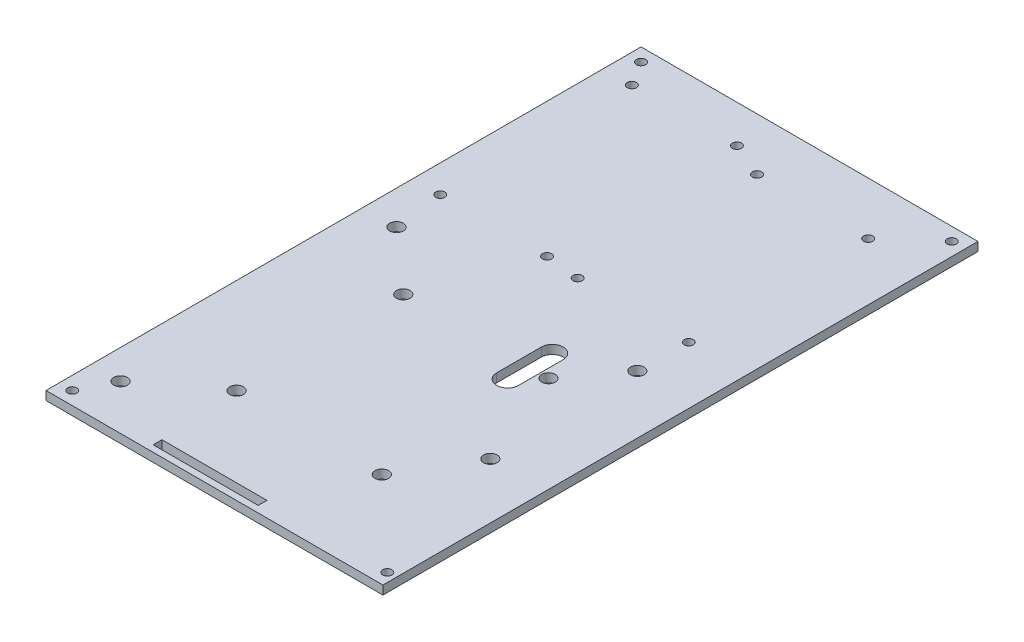
ISO-10303-21;
HEADER;
FILE_DESCRIPTION(('STEP AP214'),'2;1');
FILE_NAME('part.step','',(''),(''),'','','');
FILE_SCHEMA(('AUTOMOTIVE_DESIGN { 1 0 10303 214 1 1 1 1 }'));
ENDSEC;
DATA;
#1=APPLICATION_CONTEXT('core data for automotive mechanical design processes');
#2=APPLICATION_PROTOCOL_DEFINITION('international standard','automotive_design',2000,#1);
#3=PRODUCT_CONTEXT('',#1,'mechanical');
#4=PRODUCT('Part','Part','',(#3));
#5=PRODUCT_RELATED_PRODUCT_CATEGORY('part','',(#4));
#6=PRODUCT_DEFINITION_FORMATION('','',#4);
#7=PRODUCT_DEFINITION_CONTEXT('part definition',#1,'design');
#8=PRODUCT_DEFINITION('design','',#6,#7);
#9=PRODUCT_DEFINITION_SHAPE('','',#8);
#10=(LENGTH_UNIT() NAMED_UNIT(*) SI_UNIT(.MILLI.,.METRE.));
#11=(NAMED_UNIT(*) PLANE_ANGLE_UNIT() SI_UNIT($,.RADIAN.));
#12=(NAMED_UNIT(*) SI_UNIT($,.STERADIAN.) SOLID_ANGLE_UNIT());
#13=UNCERTAINTY_MEASURE_WITH_UNIT(LENGTH_MEASURE(1.E-05),#10,'distance_accuracy_value','');
#14=(GEOMETRIC_REPRESENTATION_CONTEXT(3) GLOBAL_UNCERTAINTY_ASSIGNED_CONTEXT((#13)) GLOBAL_UNIT_ASSIGNED_CONTEXT((#10,
#11,#12)) REPRESENTATION_CONTEXT('',''));
#15=CARTESIAN_POINT('',(0.,0.,0.));
#16=DIRECTION('',(0.,0.,1.));
#17=DIRECTION('',(1.,0.,0.));
#18=AXIS2_PLACEMENT_3D('',#15,#16,#17);
#19=CARTESIAN_POINT('',(0.,2.,0.));
#20=DIRECTION('',(0.,-1.,0.));
#21=DIRECTION('',(0.,0.,-1.));
#22=AXIS2_PLACEMENT_3D('',#19,#20,#21);
#23=PLANE('',#22);
#24=CARTESIAN_POINT('',(50.5,2.,-65.2));
#25=DIRECTION('',(0.,1.,0.));
#26=DIRECTION('',(0.,0.,1.));
#27=AXIS2_PLACEMENT_3D('',#24,#25,#26);
#28=CIRCLE('',#27,2.5);
#29=CARTESIAN_POINT('',(53.,2.,-65.2));
#30=VERTEX_POINT('',#29);
#31=CARTESIAN_POINT('',(48.,2.,-65.2));
#32=VERTEX_POINT('',#31);
#33=EDGE_CURVE('E177',#30,#32,#28,.T.);
#34=ORIENTED_EDGE('',*,*,#33,.F.);
#35=DIRECTION('',(0.,0.,-1.));
#36=VECTOR('',#35,1.);
#37=CARTESIAN_POINT('',(53.,2.,-65.2));
#38=LINE('',#37,#36);
#39=CARTESIAN_POINT('',(53.,2.,-55.));
#40=VERTEX_POINT('',#39);
#41=EDGE_CURVE('E188',#40,#30,#38,.T.);
#42=ORIENTED_EDGE('',*,*,#41,.F.);
#43=CARTESIAN_POINT('',(50.5,2.,-55.));
#44=DIRECTION('',(0.,1.,0.));
#45=DIRECTION('',(0.,0.,1.));
#46=AXIS2_PLACEMENT_3D('',#43,#44,#45);
#47=CIRCLE('',#46,2.5);
#48=CARTESIAN_POINT('',(48.,2.,-55.));
#49=VERTEX_POINT('',#48);
#50=EDGE_CURVE('E184',#49,#40,#47,.T.);
#51=ORIENTED_EDGE('',*,*,#50,.F.);
#52=DIRECTION('',(0.,0.,1.));
#53=VECTOR('',#52,1.);
#54=CARTESIAN_POINT('',(48.,2.,-65.2));
#55=LINE('',#54,#53);
#56=EDGE_CURVE('E180',#32,#49,#55,.T.);
#57=ORIENTED_EDGE('',*,*,#56,.F.);
#58=EDGE_LOOP('',(#34,#42,#51,#57));
#59=FACE_BOUND('',#58,.T.);
#60=DIRECTION('',(0.,0.,1.));
#61=VECTOR('',#60,1.);
#62=CARTESIAN_POINT('',(0.,2.,0.));
#63=LINE('',#62,#61);
#64=CARTESIAN_POINT('',(0.,2.,-136.));
#65=VERTEX_POINT('',#64);
#66=CARTESIAN_POINT('',(0.,2.,0.));
#67=VERTEX_POINT('',#66);
#68=EDGE_CURVE('E380',#65,#67,#63,.T.);
#69=ORIENTED_EDGE('',*,*,#68,.T.);
#70=DIRECTION('',(1.,0.,0.));
#71=VECTOR('',#70,1.);
#72=CARTESIAN_POINT('',(0.,2.,0.));
#73=LINE('',#72,#71);
#74=CARTESIAN_POINT('',(77.,2.,0.));
#75=VERTEX_POINT('',#74);
#76=EDGE_CURVE('E384',#67,#75,#73,.T.);
#77=ORIENTED_EDGE('',*,*,#76,.T.);
#78=DIRECTION('',(0.,0.,-1.));
#79=VECTOR('',#78,1.);
#80=CARTESIAN_POINT('',(77.,2.,0.));
#81=LINE('',#80,#79);
#82=CARTESIAN_POINT('',(77.,2.,-136.));
#83=VERTEX_POINT('',#82);
#84=EDGE_CURVE('E388',#75,#83,#81,.T.);
#85=ORIENTED_EDGE('',*,*,#84,.T.);
#86=DIRECTION('',(-1.,0.,0.));
#87=VECTOR('',#86,1.);
#88=CARTESIAN_POINT('',(0.,2.,-136.));
#89=LINE('',#88,#87);
#90=EDGE_CURVE('E391',#83,#65,#89,.T.);
#91=ORIENTED_EDGE('',*,*,#90,.T.);
#92=EDGE_LOOP('',(#69,#77,#85,#91));
#93=FACE_BOUND('',#92,.T.);
#94=CARTESIAN_POINT('',(7.71,2.,-72.38));
#95=DIRECTION('',(0.,1.,0.));
#96=DIRECTION('',(0.,0.,1.));
#97=AXIS2_PLACEMENT_3D('',#94,#95,#96);
#98=CIRCLE('',#97,1.54999999999999);
#99=CARTESIAN_POINT('',(7.71,2.,-70.83));
#100=VERTEX_POINT('',#99);
#101=EDGE_CURVE('E372',#100,#100,#98,.T.);
#102=ORIENTED_EDGE('',*,*,#101,.F.);
#103=EDGE_LOOP('',(#102));
#104=FACE_BOUND('',#103,.T.);
#105=CARTESIAN_POINT('',(6.71000000000001,2.,-10.34));
#106=DIRECTION('',(0.,1.,0.));
#107=DIRECTION('',(0.,0.,1.));
#108=AXIS2_PLACEMENT_3D('',#105,#106,#107);
#109=CIRCLE('',#108,1.55);
#110=CARTESIAN_POINT('',(6.71000000000001,2.,-8.79));
#111=VERTEX_POINT('',#110);
#112=EDGE_CURVE('E364',#111,#111,#109,.T.);
#113=ORIENTED_EDGE('',*,*,#112,.F.);
#114=EDGE_LOOP('',(#113));
#115=FACE_BOUND('',#114,.T.);
#116=CARTESIAN_POINT('',(63.71,2.,-71.44));
#117=DIRECTION('',(0.,1.,0.));
#118=DIRECTION('',(0.,0.,1.));
#119=AXIS2_PLACEMENT_3D('',#116,#117,#118);
#120=CIRCLE('',#119,1.54999999999999);
#121=CARTESIAN_POINT('',(63.71,2.,-69.89));
#122=VERTEX_POINT('',#121);
#123=EDGE_CURVE('E356',#122,#122,#120,.T.);
#124=ORIENTED_EDGE('',*,*,#123,.F.);
#125=EDGE_LOOP('',(#124));
#126=FACE_BOUND('',#125,.T.);
#127=CARTESIAN_POINT('',(64.31,2.,-37.24));
#128=DIRECTION('',(0.,1.,0.));
#129=DIRECTION('',(0.,0.,1.));
#130=AXIS2_PLACEMENT_3D('',#127,#128,#129);
#131=CIRCLE('',#130,1.54999999999999);
#132=CARTESIAN_POINT('',(64.31,2.,-35.69));
#133=VERTEX_POINT('',#132);
#134=EDGE_CURVE('E348',#133,#133,#131,.T.);
#135=ORIENTED_EDGE('',*,*,#134,.F.);
#136=EDGE_LOOP('',(#135));
#137=FACE_BOUND('',#136,.T.);
#138=CARTESIAN_POINT('',(21.81,2.,-21.74));
#139=DIRECTION('',(0.,1.,0.));
#140=DIRECTION('',(0.,0.,1.));
#141=AXIS2_PLACEMENT_3D('',#138,#139,#140);
#142=CIRCLE('',#141,1.55);
#143=CARTESIAN_POINT('',(21.81,2.,-20.19));
#144=VERTEX_POINT('',#143);
#145=EDGE_CURVE('E340',#144,#144,#142,.T.);
#146=ORIENTED_EDGE('',*,*,#145,.F.);
#147=EDGE_LOOP('',(#146));
#148=FACE_BOUND('',#147,.T.);
#149=CARTESIAN_POINT('',(55.01,2.,-21.74));
#150=DIRECTION('',(0.,1.,0.));
#151=DIRECTION('',(0.,0.,1.));
#152=AXIS2_PLACEMENT_3D('',#149,#150,#151);
#153=CIRCLE('',#152,1.55);
#154=CARTESIAN_POINT('',(55.01,2.,-20.19));
#155=VERTEX_POINT('',#154);
#156=EDGE_CURVE('E332',#155,#155,#153,.T.);
#157=ORIENTED_EDGE('',*,*,#156,.F.);
#158=EDGE_LOOP('',(#157));
#159=FACE_BOUND('',#158,.T.);
#160=CARTESIAN_POINT('',(21.81,2.,-59.84));
#161=DIRECTION('',(0.,1.,0.));
#162=DIRECTION('',(0.,0.,1.));
#163=AXIS2_PLACEMENT_3D('',#160,#161,#162);
#164=CIRCLE('',#163,1.55);
#165=CARTESIAN_POINT('',(21.81,2.,-58.29));
#166=VERTEX_POINT('',#165);
#167=EDGE_CURVE('E324',#166,#166,#164,.T.);
#168=ORIENTED_EDGE('',*,*,#167,.F.);
#169=EDGE_LOOP('',(#168));
#170=FACE_BOUND('',#169,.T.);
#171=CARTESIAN_POINT('',(55.01,2.,-59.84));
#172=DIRECTION('',(0.,1.,0.));
#173=DIRECTION('',(0.,0.,1.));
#174=AXIS2_PLACEMENT_3D('',#171,#172,#173);
#175=CIRCLE('',#174,1.55);
#176=CARTESIAN_POINT('',(55.01,2.,-58.29));
#177=VERTEX_POINT('',#176);
#178=EDGE_CURVE('E316',#177,#177,#175,.T.);
#179=ORIENTED_EDGE('',*,*,#178,.F.);
#180=EDGE_LOOP('',(#179));
#181=FACE_BOUND('',#180,.T.);
#182=CARTESIAN_POINT('',(6.49999999999999,2.,-127.4));
#183=DIRECTION('',(0.,1.,0.));
#184=DIRECTION('',(0.,0.,1.));
#185=AXIS2_PLACEMENT_3D('',#182,#183,#184);
#186=CIRCLE('',#185,1.04999999999999);
#187=CARTESIAN_POINT('',(6.49999999999999,2.,-126.35));
#188=VERTEX_POINT('',#187);
#189=EDGE_CURVE('E308',#188,#188,#186,.T.);
#190=ORIENTED_EDGE('',*,*,#189,.F.);
#191=EDGE_LOOP('',(#190));
#192=FACE_BOUND('',#191,.T.);
#193=CARTESIAN_POINT('',(30.5,2.,-127.4));
#194=DIRECTION('',(0.,1.,0.));
#195=DIRECTION('',(0.,0.,1.));
#196=AXIS2_PLACEMENT_3D('',#193,#194,#195);
#197=CIRCLE('',#196,1.05);
#198=CARTESIAN_POINT('',(30.5,2.,-126.35));
#199=VERTEX_POINT('',#198);
#200=EDGE_CURVE('E300',#199,#199,#197,.T.);
#201=ORIENTED_EDGE('',*,*,#200,.F.);
#202=EDGE_LOOP('',(#201));
#203=FACE_BOUND('',#202,.T.);
#204=CARTESIAN_POINT('',(6.3,2.,-83.8));
#205=DIRECTION('',(0.,1.,0.));
#206=DIRECTION('',(0.,0.,1.));
#207=AXIS2_PLACEMENT_3D('',#204,#205,#206);
#208=CIRCLE('',#207,1.04999999999999);
#209=CARTESIAN_POINT('',(6.3,2.,-82.75));
#210=VERTEX_POINT('',#209);
#211=EDGE_CURVE('E292',#210,#210,#208,.T.);
#212=ORIENTED_EDGE('',*,*,#211,.F.);
#213=EDGE_LOOP('',(#212));
#214=FACE_BOUND('',#213,.T.);
#215=CARTESIAN_POINT('',(30.7,2.,-83.8));
#216=DIRECTION('',(0.,1.,0.));
#217=DIRECTION('',(0.,0.,1.));
#218=AXIS2_PLACEMENT_3D('',#215,#216,#217);
#219=CIRCLE('',#218,1.05);
#220=CARTESIAN_POINT('',(30.7,2.,-82.75));
#221=VERTEX_POINT('',#220);
#222=EDGE_CURVE('E284',#221,#221,#219,.T.);
#223=ORIENTED_EDGE('',*,*,#222,.F.);
#224=EDGE_LOOP('',(#223));
#225=FACE_BOUND('',#224,.T.);
#226=CARTESIAN_POINT('',(38.5,2.,-124.));
#227=DIRECTION('',(0.,1.,0.));
#228=DIRECTION('',(0.,0.,1.));
#229=AXIS2_PLACEMENT_3D('',#226,#227,#228);
#230=CIRCLE('',#229,1.05);
#231=CARTESIAN_POINT('',(38.5,2.,-122.95));
#232=VERTEX_POINT('',#231);
#233=EDGE_CURVE('E276',#232,#232,#230,.T.);
#234=ORIENTED_EDGE('',*,*,#233,.F.);
#235=EDGE_LOOP('',(#234));
#236=FACE_BOUND('',#235,.T.);
#237=CARTESIAN_POINT('',(63.9,2.,-124.));
#238=DIRECTION('',(0.,1.,0.));
#239=DIRECTION('',(0.,0.,1.));
#240=AXIS2_PLACEMENT_3D('',#237,#238,#239);
#241=CIRCLE('',#240,1.04999999999999);
#242=CARTESIAN_POINT('',(63.9,2.,-122.95));
#243=VERTEX_POINT('',#242);
#244=EDGE_CURVE('E268',#243,#243,#241,.T.);
#245=ORIENTED_EDGE('',*,*,#244,.F.);
#246=EDGE_LOOP('',(#245));
#247=FACE_BOUND('',#246,.T.);
#248=CARTESIAN_POINT('',(38.5,2.,-83.));
#249=DIRECTION('',(0.,1.,0.));
#250=DIRECTION('',(0.,0.,1.));
#251=AXIS2_PLACEMENT_3D('',#248,#249,#250);
#252=CIRCLE('',#251,1.05);
#253=CARTESIAN_POINT('',(38.5,2.,-81.95));
#254=VERTEX_POINT('',#253);
#255=EDGE_CURVE('E260',#254,#254,#252,.T.);
#256=ORIENTED_EDGE('',*,*,#255,.F.);
#257=EDGE_LOOP('',(#256));
#258=FACE_BOUND('',#257,.T.);
#259=CARTESIAN_POINT('',(63.9,2.,-83.));
#260=DIRECTION('',(0.,1.,0.));
#261=DIRECTION('',(0.,0.,1.));
#262=AXIS2_PLACEMENT_3D('',#259,#260,#261);
#263=CIRCLE('',#262,1.04999999999999);
#264=CARTESIAN_POINT('',(63.9,2.,-81.95));
#265=VERTEX_POINT('',#264);
#266=EDGE_CURVE('E252',#265,#265,#263,.T.);
#267=ORIENTED_EDGE('',*,*,#266,.F.);
#268=EDGE_LOOP('',(#267));
#269=FACE_BOUND('',#268,.T.);
#270=CARTESIAN_POINT('',(3.00000000000002,2.,-3.));
#271=DIRECTION('',(0.,1.,0.));
#272=DIRECTION('',(0.,0.,1.));
#273=AXIS2_PLACEMENT_3D('',#270,#271,#272);
#274=CIRCLE('',#273,1.05);
#275=CARTESIAN_POINT('',(3.00000000000002,2.,-1.95));
#276=VERTEX_POINT('',#275);
#277=EDGE_CURVE('E244',#276,#276,#274,.T.);
#278=ORIENTED_EDGE('',*,*,#277,.F.);
#279=EDGE_LOOP('',(#278));
#280=FACE_BOUND('',#279,.T.);
#281=CARTESIAN_POINT('',(75.,2.,-3.));
#282=DIRECTION('',(0.,1.,0.));
#283=DIRECTION('',(0.,0.,1.));
#284=AXIS2_PLACEMENT_3D('',#281,#282,#283);
#285=CIRCLE('',#284,1.04999999999999);
#286=CARTESIAN_POINT('',(75.,2.,-1.95000000000001));
#287=VERTEX_POINT('',#286);
#288=EDGE_CURVE('E236',#287,#287,#285,.T.);
#289=ORIENTED_EDGE('',*,*,#288,.F.);
#290=EDGE_LOOP('',(#289));
#291=FACE_BOUND('',#290,.T.);
#292=CARTESIAN_POINT('',(3.,2.,-133.));
#293=DIRECTION('',(0.,1.,0.));
#294=DIRECTION('',(0.,0.,1.));
#295=AXIS2_PLACEMENT_3D('',#292,#293,#294);
#296=CIRCLE('',#295,1.04999999999999);
#297=CARTESIAN_POINT('',(3.,2.,-131.95));
#298=VERTEX_POINT('',#297);
#299=EDGE_CURVE('E228',#298,#298,#296,.T.);
#300=ORIENTED_EDGE('',*,*,#299,.F.);
#301=EDGE_LOOP('',(#300));
#302=FACE_BOUND('',#301,.T.);
#303=CARTESIAN_POINT('',(74.,2.,-133.));
#304=DIRECTION('',(0.,1.,0.));
#305=DIRECTION('',(0.,0.,1.));
#306=AXIS2_PLACEMENT_3D('',#303,#304,#305);
#307=CIRCLE('',#306,1.04999999999999);
#308=CARTESIAN_POINT('',(74.,2.,-131.95));
#309=VERTEX_POINT('',#308);
#310=EDGE_CURVE('E220',#309,#309,#307,.T.);
#311=ORIENTED_EDGE('',*,*,#310,.F.);
#312=EDGE_LOOP('',(#311));
#313=FACE_BOUND('',#312,.T.);
#314=DIRECTION('',(0.,0.,1.));
#315=VECTOR('',#314,1.);
#316=CARTESIAN_POINT('',(23.,2.,-1.5));
#317=LINE('',#316,#315);
#318=CARTESIAN_POINT('',(23.,2.,-3.5));
#319=VERTEX_POINT('',#318);
#320=CARTESIAN_POINT('',(23.,2.,-1.5));
#321=VERTEX_POINT('',#320);
#322=EDGE_CURVE('E129',#319,#321,#317,.T.);
#323=ORIENTED_EDGE('',*,*,#322,.F.);
#324=DIRECTION('',(-1.,0.,0.));
#325=VECTOR('',#324,1.);
#326=CARTESIAN_POINT('',(23.,2.,-3.5));
#327=LINE('',#326,#325);
#328=CARTESIAN_POINT('',(47.,2.,-3.5));
#329=VERTEX_POINT('',#328);
#330=EDGE_CURVE('E155',#329,#319,#327,.T.);
#331=ORIENTED_EDGE('',*,*,#330,.F.);
#332=DIRECTION('',(0.,0.,-1.));
#333=VECTOR('',#332,1.);
#334=CARTESIAN_POINT('',(47.,2.,-1.5));
#335=LINE('',#334,#333);
#336=CARTESIAN_POINT('',(47.,2.,-1.5));
#337=VERTEX_POINT('',#336);
#338=EDGE_CURVE('E151',#337,#329,#335,.T.);
#339=ORIENTED_EDGE('',*,*,#338,.F.);
#340=DIRECTION('',(1.,0.,0.));
#341=VECTOR('',#340,1.);
#342=CARTESIAN_POINT('',(23.,2.,-1.5));
#343=LINE('',#342,#341);
#344=EDGE_CURVE('E138',#321,#337,#343,.T.);
#345=ORIENTED_EDGE('',*,*,#344,.F.);
#346=EDGE_LOOP('',(#323,#331,#339,#345));
#347=FACE_BOUND('',#346,.T.);
#348=ADVANCED_FACE('F39',(#59,#93,#104,#115,#126,#137,#148,#159,#170,#181,#192,#203,#214,#225,
#236,#247,#258,#269,#280,#291,#302,#313,#347),#23,.F.);
#349=CARTESIAN_POINT('',(0.,0.,0.));
#350=DIRECTION('',(0.,-1.,0.));
#351=DIRECTION('',(0.,0.,-1.));
#352=AXIS2_PLACEMENT_3D('',#349,#350,#351);
#353=PLANE('',#352);
#354=CARTESIAN_POINT('',(3.,0.,-133.));
#355=DIRECTION('',(0.,1.,0.));
#356=DIRECTION('',(0.,0.,1.));
#357=AXIS2_PLACEMENT_3D('',#354,#355,#356);
#358=CIRCLE('',#357,1.04999999999999);
#359=CARTESIAN_POINT('',(3.,0.,-131.95));
#360=VERTEX_POINT('',#359);
#361=EDGE_CURVE('E224',#360,#360,#358,.T.);
#362=ORIENTED_EDGE('',*,*,#361,.T.);
#363=EDGE_LOOP('',(#362));
#364=FACE_BOUND('',#363,.T.);
#365=CARTESIAN_POINT('',(3.00000000000002,0.,-3.));
#366=DIRECTION('',(0.,1.,0.));
#367=DIRECTION('',(0.,0.,1.));
#368=AXIS2_PLACEMENT_3D('',#365,#366,#367);
#369=CIRCLE('',#368,1.05);
#370=CARTESIAN_POINT('',(3.00000000000002,0.,-1.95));
#371=VERTEX_POINT('',#370);
#372=EDGE_CURVE('E240',#371,#371,#369,.T.);
#373=ORIENTED_EDGE('',*,*,#372,.T.);
#374=EDGE_LOOP('',(#373));
#375=FACE_BOUND('',#374,.T.);
#376=CARTESIAN_POINT('',(38.5,0.,-83.));
#377=DIRECTION('',(0.,1.,0.));
#378=DIRECTION('',(0.,0.,1.));
#379=AXIS2_PLACEMENT_3D('',#376,#377,#378);
#380=CIRCLE('',#379,1.05);
#381=CARTESIAN_POINT('',(38.5,0.,-81.95));
#382=VERTEX_POINT('',#381);
#383=EDGE_CURVE('E256',#382,#382,#380,.T.);
#384=ORIENTED_EDGE('',*,*,#383,.T.);
#385=EDGE_LOOP('',(#384));
#386=FACE_BOUND('',#385,.T.);
#387=CARTESIAN_POINT('',(38.5,0.,-124.));
#388=DIRECTION('',(0.,1.,0.));
#389=DIRECTION('',(0.,0.,1.));
#390=AXIS2_PLACEMENT_3D('',#387,#388,#389);
#391=CIRCLE('',#390,1.05);
#392=CARTESIAN_POINT('',(38.5,0.,-122.95));
#393=VERTEX_POINT('',#392);
#394=EDGE_CURVE('E272',#393,#393,#391,.T.);
#395=ORIENTED_EDGE('',*,*,#394,.T.);
#396=EDGE_LOOP('',(#395));
#397=FACE_BOUND('',#396,.T.);
#398=CARTESIAN_POINT('',(6.3,0.,-83.8));
#399=DIRECTION('',(0.,1.,0.));
#400=DIRECTION('',(0.,0.,1.));
#401=AXIS2_PLACEMENT_3D('',#398,#399,#400);
#402=CIRCLE('',#401,1.04999999999999);
#403=CARTESIAN_POINT('',(6.3,0.,-82.75));
#404=VERTEX_POINT('',#403);
#405=EDGE_CURVE('E288',#404,#404,#402,.T.);
#406=ORIENTED_EDGE('',*,*,#405,.T.);
#407=EDGE_LOOP('',(#406));
#408=FACE_BOUND('',#407,.T.);
#409=CARTESIAN_POINT('',(6.49999999999999,0.,-127.4));
#410=DIRECTION('',(0.,1.,0.));
#411=DIRECTION('',(0.,0.,1.));
#412=AXIS2_PLACEMENT_3D('',#409,#410,#411);
#413=CIRCLE('',#412,1.04999999999999);
#414=CARTESIAN_POINT('',(6.49999999999999,0.,-126.35));
#415=VERTEX_POINT('',#414);
#416=EDGE_CURVE('E304',#415,#415,#413,.T.);
#417=ORIENTED_EDGE('',*,*,#416,.T.);
#418=EDGE_LOOP('',(#417));
#419=FACE_BOUND('',#418,.T.);
#420=CARTESIAN_POINT('',(21.81,0.,-59.84));
#421=DIRECTION('',(0.,1.,0.));
#422=DIRECTION('',(0.,0.,1.));
#423=AXIS2_PLACEMENT_3D('',#420,#421,#422);
#424=CIRCLE('',#423,1.55);
#425=CARTESIAN_POINT('',(21.81,0.,-58.29));
#426=VERTEX_POINT('',#425);
#427=EDGE_CURVE('E320',#426,#426,#424,.T.);
#428=ORIENTED_EDGE('',*,*,#427,.T.);
#429=EDGE_LOOP('',(#428));
#430=FACE_BOUND('',#429,.T.);
#431=CARTESIAN_POINT('',(21.81,0.,-21.74));
#432=DIRECTION('',(0.,1.,0.));
#433=DIRECTION('',(0.,0.,1.));
#434=AXIS2_PLACEMENT_3D('',#431,#432,#433);
#435=CIRCLE('',#434,1.55);
#436=CARTESIAN_POINT('',(21.81,0.,-20.19));
#437=VERTEX_POINT('',#436);
#438=EDGE_CURVE('E336',#437,#437,#435,.T.);
#439=ORIENTED_EDGE('',*,*,#438,.T.);
#440=EDGE_LOOP('',(#439));
#441=FACE_BOUND('',#440,.T.);
#442=CARTESIAN_POINT('',(63.71,0.,-71.44));
#443=DIRECTION('',(0.,1.,0.));
#444=DIRECTION('',(0.,0.,1.));
#445=AXIS2_PLACEMENT_3D('',#442,#443,#444);
#446=CIRCLE('',#445,1.54999999999999);
#447=CARTESIAN_POINT('',(63.71,0.,-69.89));
#448=VERTEX_POINT('',#447);
#449=EDGE_CURVE('E352',#448,#448,#446,.T.);
#450=ORIENTED_EDGE('',*,*,#449,.T.);
#451=EDGE_LOOP('',(#450));
#452=FACE_BOUND('',#451,.T.);
#453=CARTESIAN_POINT('',(7.71,0.,-72.38));
#454=DIRECTION('',(0.,1.,0.));
#455=DIRECTION('',(0.,0.,1.));
#456=AXIS2_PLACEMENT_3D('',#453,#454,#455);
#457=CIRCLE('',#456,1.54999999999999);
#458=CARTESIAN_POINT('',(7.71,0.,-70.83));
#459=VERTEX_POINT('',#458);
#460=EDGE_CURVE('E368',#459,#459,#457,.T.);
#461=ORIENTED_EDGE('',*,*,#460,.T.);
#462=EDGE_LOOP('',(#461));
#463=FACE_BOUND('',#462,.T.);
#464=DIRECTION('',(0.,0.,1.));
#465=VECTOR('',#464,1.);
#466=CARTESIAN_POINT('',(0.,0.,0.));
#467=LINE('',#466,#465);
#468=CARTESIAN_POINT('',(0.,0.,-136.));
#469=VERTEX_POINT('',#468);
#470=CARTESIAN_POINT('',(0.,0.,0.));
#471=VERTEX_POINT('',#470);
#472=EDGE_CURVE('E376',#469,#471,#467,.T.);
#473=ORIENTED_EDGE('',*,*,#472,.F.);
#474=DIRECTION('',(-1.,0.,0.));
#475=VECTOR('',#474,1.);
#476=CARTESIAN_POINT('',(0.,0.,-136.));
#477=LINE('',#476,#475);
#478=CARTESIAN_POINT('',(77.,0.,-136.));
#479=VERTEX_POINT('',#478);
#480=EDGE_CURVE('E385',#479,#469,#477,.T.);
#481=ORIENTED_EDGE('',*,*,#480,.F.);
#482=DIRECTION('',(0.,0.,-1.));
#483=VECTOR('',#482,1.);
#484=CARTESIAN_POINT('',(77.,0.,0.));
#485=LINE('',#484,#483);
#486=CARTESIAN_POINT('',(77.,0.,0.));
#487=VERTEX_POINT('',#486);
#488=EDGE_CURVE('E401',#487,#479,#485,.T.);
#489=ORIENTED_EDGE('',*,*,#488,.F.);
#490=DIRECTION('',(1.,0.,0.));
#491=VECTOR('',#490,1.);
#492=CARTESIAN_POINT('',(0.,0.,0.));
#493=LINE('',#492,#491);
#494=EDGE_CURVE('E398',#471,#487,#493,.T.);
#495=ORIENTED_EDGE('',*,*,#494,.F.);
#496=EDGE_LOOP('',(#473,#481,#489,#495));
#497=FACE_BOUND('',#496,.T.);
#498=CARTESIAN_POINT('',(6.71000000000001,0.,-10.34));
#499=DIRECTION('',(0.,1.,0.));
#500=DIRECTION('',(0.,0.,1.));
#501=AXIS2_PLACEMENT_3D('',#498,#499,#500);
#502=CIRCLE('',#501,1.55);
#503=CARTESIAN_POINT('',(6.71000000000001,0.,-8.79));
#504=VERTEX_POINT('',#503);
#505=EDGE_CURVE('E360',#504,#504,#502,.T.);
#506=ORIENTED_EDGE('',*,*,#505,.T.);
#507=EDGE_LOOP('',(#506));
#508=FACE_BOUND('',#507,.T.);
#509=CARTESIAN_POINT('',(64.31,0.,-37.24));
#510=DIRECTION('',(0.,1.,0.));
#511=DIRECTION('',(0.,0.,1.));
#512=AXIS2_PLACEMENT_3D('',#509,#510,#511);
#513=CIRCLE('',#512,1.54999999999999);
#514=CARTESIAN_POINT('',(64.31,0.,-35.69));
#515=VERTEX_POINT('',#514);
#516=EDGE_CURVE('E344',#515,#515,#513,.T.);
#517=ORIENTED_EDGE('',*,*,#516,.T.);
#518=EDGE_LOOP('',(#517));
#519=FACE_BOUND('',#518,.T.);
#520=CARTESIAN_POINT('',(55.01,0.,-21.74));
#521=DIRECTION('',(0.,1.,0.));
#522=DIRECTION('',(0.,0.,1.));
#523=AXIS2_PLACEMENT_3D('',#520,#521,#522);
#524=CIRCLE('',#523,1.55);
#525=CARTESIAN_POINT('',(55.01,0.,-20.19));
#526=VERTEX_POINT('',#525);
#527=EDGE_CURVE('E328',#526,#526,#524,.T.);
#528=ORIENTED_EDGE('',*,*,#527,.T.);
#529=EDGE_LOOP('',(#528));
#530=FACE_BOUND('',#529,.T.);
#531=CARTESIAN_POINT('',(55.01,0.,-59.84));
#532=DIRECTION('',(0.,1.,0.));
#533=DIRECTION('',(0.,0.,1.));
#534=AXIS2_PLACEMENT_3D('',#531,#532,#533);
#535=CIRCLE('',#534,1.55);
#536=CARTESIAN_POINT('',(55.01,0.,-58.29));
#537=VERTEX_POINT('',#536);
#538=EDGE_CURVE('E312',#537,#537,#535,.T.);
#539=ORIENTED_EDGE('',*,*,#538,.T.);
#540=EDGE_LOOP('',(#539));
#541=FACE_BOUND('',#540,.T.);
#542=CARTESIAN_POINT('',(30.5,0.,-127.4));
#543=DIRECTION('',(0.,1.,0.));
#544=DIRECTION('',(0.,0.,1.));
#545=AXIS2_PLACEMENT_3D('',#542,#543,#544);
#546=CIRCLE('',#545,1.05);
#547=CARTESIAN_POINT('',(30.5,0.,-126.35));
#548=VERTEX_POINT('',#547);
#549=EDGE_CURVE('E296',#548,#548,#546,.T.);
#550=ORIENTED_EDGE('',*,*,#549,.T.);
#551=EDGE_LOOP('',(#550));
#552=FACE_BOUND('',#551,.T.);
#553=CARTESIAN_POINT('',(30.7,0.,-83.8));
#554=DIRECTION('',(0.,1.,0.));
#555=DIRECTION('',(0.,0.,1.));
#556=AXIS2_PLACEMENT_3D('',#553,#554,#555);
#557=CIRCLE('',#556,1.05);
#558=CARTESIAN_POINT('',(30.7,0.,-82.75));
#559=VERTEX_POINT('',#558);
#560=EDGE_CURVE('E280',#559,#559,#557,.T.);
#561=ORIENTED_EDGE('',*,*,#560,.T.);
#562=EDGE_LOOP('',(#561));
#563=FACE_BOUND('',#562,.T.);
#564=CARTESIAN_POINT('',(63.9,0.,-124.));
#565=DIRECTION('',(0.,1.,0.));
#566=DIRECTION('',(0.,0.,1.));
#567=AXIS2_PLACEMENT_3D('',#564,#565,#566);
#568=CIRCLE('',#567,1.04999999999999);
#569=CARTESIAN_POINT('',(63.9,0.,-122.95));
#570=VERTEX_POINT('',#569);
#571=EDGE_CURVE('E264',#570,#570,#568,.T.);
#572=ORIENTED_EDGE('',*,*,#571,.T.);
#573=EDGE_LOOP('',(#572));
#574=FACE_BOUND('',#573,.T.);
#575=CARTESIAN_POINT('',(63.9,0.,-83.));
#576=DIRECTION('',(0.,1.,0.));
#577=DIRECTION('',(0.,0.,1.));
#578=AXIS2_PLACEMENT_3D('',#575,#576,#577);
#579=CIRCLE('',#578,1.04999999999999);
#580=CARTESIAN_POINT('',(63.9,0.,-81.95));
#581=VERTEX_POINT('',#580);
#582=EDGE_CURVE('E248',#581,#581,#579,.T.);
#583=ORIENTED_EDGE('',*,*,#582,.T.);
#584=EDGE_LOOP('',(#583));
#585=FACE_BOUND('',#584,.T.);
#586=CARTESIAN_POINT('',(75.,0.,-3.));
#587=DIRECTION('',(0.,1.,0.));
#588=DIRECTION('',(0.,0.,1.));
#589=AXIS2_PLACEMENT_3D('',#586,#587,#588);
#590=CIRCLE('',#589,1.04999999999999);
#591=CARTESIAN_POINT('',(75.,0.,-1.95000000000001));
#592=VERTEX_POINT('',#591);
#593=EDGE_CURVE('E232',#592,#592,#590,.T.);
#594=ORIENTED_EDGE('',*,*,#593,.T.);
#595=EDGE_LOOP('',(#594));
#596=FACE_BOUND('',#595,.T.);
#597=CARTESIAN_POINT('',(74.,0.,-133.));
#598=DIRECTION('',(0.,1.,0.));
#599=DIRECTION('',(0.,0.,1.));
#600=AXIS2_PLACEMENT_3D('',#597,#598,#599);
#601=CIRCLE('',#600,1.04999999999999);
#602=CARTESIAN_POINT('',(74.,0.,-131.95));
#603=VERTEX_POINT('',#602);
#604=EDGE_CURVE('E219',#603,#603,#601,.T.);
#605=ORIENTED_EDGE('',*,*,#604,.T.);
#606=EDGE_LOOP('',(#605));
#607=FACE_BOUND('',#606,.T.);
#608=DIRECTION('',(0.,0.,-1.));
#609=VECTOR('',#608,1.);
#610=CARTESIAN_POINT('',(53.,0.,-65.2));
#611=LINE('',#610,#609);
#612=CARTESIAN_POINT('',(53.,0.,-55.));
#613=VERTEX_POINT('',#612);
#614=CARTESIAN_POINT('',(53.,0.,-65.2));
#615=VERTEX_POINT('',#614);
#616=EDGE_CURVE('E181',#613,#615,#611,.T.);
#617=ORIENTED_EDGE('',*,*,#616,.T.);
#618=CARTESIAN_POINT('',(50.5,0.,-65.2));
#619=DIRECTION('',(0.,1.,0.));
#620=DIRECTION('',(0.,0.,1.));
#621=AXIS2_PLACEMENT_3D('',#618,#619,#620);
#622=CIRCLE('',#621,2.5);
#623=CARTESIAN_POINT('',(48.,0.,-65.2));
#624=VERTEX_POINT('',#623);
#625=EDGE_CURVE('E147',#615,#624,#622,.T.);
#626=ORIENTED_EDGE('',*,*,#625,.T.);
#627=DIRECTION('',(0.,0.,1.));
#628=VECTOR('',#627,1.);
#629=CARTESIAN_POINT('',(48.,0.,-65.2));
#630=LINE('',#629,#628);
#631=CARTESIAN_POINT('',(48.,0.,-55.));
#632=VERTEX_POINT('',#631);
#633=EDGE_CURVE('E195',#624,#632,#630,.T.);
#634=ORIENTED_EDGE('',*,*,#633,.T.);
#635=CARTESIAN_POINT('',(50.5,0.,-55.));
#636=DIRECTION('',(0.,1.,0.));
#637=DIRECTION('',(0.,0.,1.));
#638=AXIS2_PLACEMENT_3D('',#635,#636,#637);
#639=CIRCLE('',#638,2.5);
#640=EDGE_CURVE('E199',#632,#613,#639,.T.);
#641=ORIENTED_EDGE('',*,*,#640,.T.);
#642=EDGE_LOOP('',(#617,#626,#634,#641));
#643=FACE_BOUND('',#642,.T.);
#644=DIRECTION('',(-1.,0.,0.));
#645=VECTOR('',#644,1.);
#646=CARTESIAN_POINT('',(23.,0.,-3.5));
#647=LINE('',#646,#645);
#648=CARTESIAN_POINT('',(47.,0.,-3.5));
#649=VERTEX_POINT('',#648);
#650=CARTESIAN_POINT('',(23.,0.,-3.5));
#651=VERTEX_POINT('',#650);
#652=EDGE_CURVE('E139',#649,#651,#647,.T.);
#653=ORIENTED_EDGE('',*,*,#652,.T.);
#654=DIRECTION('',(0.,0.,1.));
#655=VECTOR('',#654,1.);
#656=CARTESIAN_POINT('',(23.,0.,-1.5));
#657=LINE('',#656,#655);
#658=CARTESIAN_POINT('',(23.,0.,-1.5));
#659=VERTEX_POINT('',#658);
#660=EDGE_CURVE('E63',#651,#659,#657,.T.);
#661=ORIENTED_EDGE('',*,*,#660,.T.);
#662=DIRECTION('',(1.,0.,0.));
#663=VECTOR('',#662,1.);
#664=CARTESIAN_POINT('',(23.,0.,-1.5));
#665=LINE('',#664,#663);
#666=CARTESIAN_POINT('',(47.,0.,-1.5));
#667=VERTEX_POINT('',#666);
#668=EDGE_CURVE('E145',#659,#667,#665,.T.);
#669=ORIENTED_EDGE('',*,*,#668,.T.);
#670=DIRECTION('',(0.,0.,-1.));
#671=VECTOR('',#670,1.);
#672=CARTESIAN_POINT('',(47.,0.,-1.5));
#673=LINE('',#672,#671);
#674=EDGE_CURVE('E164',#667,#649,#673,.T.);
#675=ORIENTED_EDGE('',*,*,#674,.T.);
#676=EDGE_LOOP('',(#653,#661,#669,#675));
#677=FACE_BOUND('',#676,.T.);
#678=ADVANCED_FACE('F424',(#364,#375,#386,#397,#408,#419,#430,#441,#452,#463,#497,#508,#519,
#530,#541,#552,#563,#574,#585,#596,#607,#643,#677),#353,.T.);
#679=CARTESIAN_POINT('',(0.,2.,0.));
#680=DIRECTION('',(1.,0.,0.));
#681=DIRECTION('',(0.,0.,-1.));
#682=AXIS2_PLACEMENT_3D('',#679,#680,#681);
#683=PLANE('',#682);
#684=ORIENTED_EDGE('',*,*,#472,.T.);
#685=DIRECTION('',(0.,-1.,0.));
#686=VECTOR('',#685,1.);
#687=CARTESIAN_POINT('',(0.,2.,0.));
#688=LINE('',#687,#686);
#689=EDGE_CURVE('E11',#67,#471,#688,.T.);
#690=ORIENTED_EDGE('',*,*,#689,.F.);
#691=ORIENTED_EDGE('',*,*,#68,.F.);
#692=DIRECTION('',(0.,-1.,0.));
#693=VECTOR('',#692,1.);
#694=CARTESIAN_POINT('',(0.,2.,-136.));
#695=LINE('',#694,#693);
#696=EDGE_CURVE('E394',#65,#469,#695,.T.);
#697=ORIENTED_EDGE('',*,*,#696,.T.);
#698=EDGE_LOOP('',(#684,#690,#691,#697));
#699=FACE_BOUND('',#698,.T.);
#700=ADVANCED_FACE('F41',(#699),#683,.F.);
#701=CARTESIAN_POINT('',(0.,2.,0.));
#702=DIRECTION('',(0.,0.,-1.));
#703=DIRECTION('',(-1.,0.,0.));
#704=AXIS2_PLACEMENT_3D('',#701,#702,#703);
#705=PLANE('',#704);
#706=ORIENTED_EDGE('',*,*,#494,.T.);
#707=DIRECTION('',(0.,-1.,0.));
#708=VECTOR('',#707,1.);
#709=CARTESIAN_POINT('',(77.,2.,0.));
#710=LINE('',#709,#708);
#711=EDGE_CURVE('E48',#75,#487,#710,.T.);
#712=ORIENTED_EDGE('',*,*,#711,.F.);
#713=ORIENTED_EDGE('',*,*,#76,.F.);
#714=ORIENTED_EDGE('',*,*,#689,.T.);
#715=EDGE_LOOP('',(#706,#712,#713,#714));
#716=FACE_BOUND('',#715,.T.);
#717=ADVANCED_FACE('F435',(#716),#705,.F.);
#718=CARTESIAN_POINT('',(77.,2.,0.));
#719=DIRECTION('',(-1.,0.,0.));
#720=DIRECTION('',(0.,0.,1.));
#721=AXIS2_PLACEMENT_3D('',#718,#719,#720);
#722=PLANE('',#721);
#723=ORIENTED_EDGE('',*,*,#488,.T.);
#724=DIRECTION('',(0.,-1.,0.));
#725=VECTOR('',#724,1.);
#726=CARTESIAN_POINT('',(77.,2.,-136.));
#727=LINE('',#726,#725);
#728=EDGE_CURVE('E409',#83,#479,#727,.T.);
#729=ORIENTED_EDGE('',*,*,#728,.F.);
#730=ORIENTED_EDGE('',*,*,#84,.F.);
#731=ORIENTED_EDGE('',*,*,#711,.T.);
#732=EDGE_LOOP('',(#723,#729,#730,#731));
#733=FACE_BOUND('',#732,.T.);
#734=ADVANCED_FACE('F418',(#733),#722,.F.);
#735=CARTESIAN_POINT('',(0.,2.,-136.));
#736=DIRECTION('',(0.,0.,1.));
#737=DIRECTION('',(1.,0.,0.));
#738=AXIS2_PLACEMENT_3D('',#735,#736,#737);
#739=PLANE('',#738);
#740=ORIENTED_EDGE('',*,*,#480,.T.);
#741=ORIENTED_EDGE('',*,*,#696,.F.);
#742=ORIENTED_EDGE('',*,*,#90,.F.);
#743=ORIENTED_EDGE('',*,*,#728,.T.);
#744=EDGE_LOOP('',(#740,#741,#742,#743));
#745=FACE_BOUND('',#744,.T.);
#746=ADVANCED_FACE('F428',(#745),#739,.F.);
#747=CARTESIAN_POINT('',(7.71,2.,-72.38));
#748=DIRECTION('',(0.,-1.,0.));
#749=DIRECTION('',(0.,0.,-1.));
#750=AXIS2_PLACEMENT_3D('',#747,#748,#749);
#751=CYLINDRICAL_SURFACE('',#750,1.54999999999999);
#752=ORIENTED_EDGE('',*,*,#101,.T.);
#753=EDGE_LOOP('',(#752));
#754=FACE_BOUND('',#753,.T.);
#755=ORIENTED_EDGE('',*,*,#460,.F.);
#756=EDGE_LOOP('',(#755));
#757=FACE_BOUND('',#756,.T.);
#758=ADVANCED_FACE('F452',(#754,#757),#751,.F.);
#759=CARTESIAN_POINT('',(6.71000000000001,2.,-10.34));
#760=DIRECTION('',(0.,-1.,0.));
#761=DIRECTION('',(0.,0.,-1.));
#762=AXIS2_PLACEMENT_3D('',#759,#760,#761);
#763=CYLINDRICAL_SURFACE('',#762,1.55);
#764=ORIENTED_EDGE('',*,*,#112,.T.);
#765=EDGE_LOOP('',(#764));
#766=FACE_BOUND('',#765,.T.);
#767=ORIENTED_EDGE('',*,*,#505,.F.);
#768=EDGE_LOOP('',(#767));
#769=FACE_BOUND('',#768,.T.);
#770=ADVANCED_FACE('F459',(#766,#769),#763,.F.);
#771=CARTESIAN_POINT('',(63.71,2.,-71.44));
#772=DIRECTION('',(0.,-1.,0.));
#773=DIRECTION('',(0.,0.,-1.));
#774=AXIS2_PLACEMENT_3D('',#771,#772,#773);
#775=CYLINDRICAL_SURFACE('',#774,1.54999999999999);
#776=ORIENTED_EDGE('',*,*,#123,.T.);
#777=EDGE_LOOP('',(#776));
#778=FACE_BOUND('',#777,.T.);
#779=ORIENTED_EDGE('',*,*,#449,.F.);
#780=EDGE_LOOP('',(#779));
#781=FACE_BOUND('',#780,.T.);
#782=ADVANCED_FACE('F464',(#778,#781),#775,.F.);
#783=CARTESIAN_POINT('',(64.31,2.,-37.24));
#784=DIRECTION('',(0.,-1.,0.));
#785=DIRECTION('',(0.,0.,-1.));
#786=AXIS2_PLACEMENT_3D('',#783,#784,#785);
#787=CYLINDRICAL_SURFACE('',#786,1.54999999999999);
#788=ORIENTED_EDGE('',*,*,#134,.T.);
#789=EDGE_LOOP('',(#788));
#790=FACE_BOUND('',#789,.T.);
#791=ORIENTED_EDGE('',*,*,#516,.F.);
#792=EDGE_LOOP('',(#791));
#793=FACE_BOUND('',#792,.T.);
#794=ADVANCED_FACE('F608',(#790,#793),#787,.F.);
#795=CARTESIAN_POINT('',(21.81,2.,-21.74));
#796=DIRECTION('',(0.,-1.,0.));
#797=DIRECTION('',(0.,0.,-1.));
#798=AXIS2_PLACEMENT_3D('',#795,#796,#797);
#799=CYLINDRICAL_SURFACE('',#798,1.55);
#800=ORIENTED_EDGE('',*,*,#145,.T.);
#801=EDGE_LOOP('',(#800));
#802=FACE_BOUND('',#801,.T.);
#803=ORIENTED_EDGE('',*,*,#438,.F.);
#804=EDGE_LOOP('',(#803));
#805=FACE_BOUND('',#804,.T.);
#806=ADVANCED_FACE('F604',(#802,#805),#799,.F.);
#807=CARTESIAN_POINT('',(55.01,2.,-21.74));
#808=DIRECTION('',(0.,-1.,0.));
#809=DIRECTION('',(0.,0.,-1.));
#810=AXIS2_PLACEMENT_3D('',#807,#808,#809);
#811=CYLINDRICAL_SURFACE('',#810,1.55);
#812=ORIENTED_EDGE('',*,*,#156,.T.);
#813=EDGE_LOOP('',(#812));
#814=FACE_BOUND('',#813,.T.);
#815=ORIENTED_EDGE('',*,*,#527,.F.);
#816=EDGE_LOOP('',(#815));
#817=FACE_BOUND('',#816,.T.);
#818=ADVANCED_FACE('F600',(#814,#817),#811,.F.);
#819=CARTESIAN_POINT('',(21.81,2.,-59.84));
#820=DIRECTION('',(0.,-1.,0.));
#821=DIRECTION('',(0.,0.,-1.));
#822=AXIS2_PLACEMENT_3D('',#819,#820,#821);
#823=CYLINDRICAL_SURFACE('',#822,1.55);
#824=ORIENTED_EDGE('',*,*,#167,.T.);
#825=EDGE_LOOP('',(#824));
#826=FACE_BOUND('',#825,.T.);
#827=ORIENTED_EDGE('',*,*,#427,.F.);
#828=EDGE_LOOP('',(#827));
#829=FACE_BOUND('',#828,.T.);
#830=ADVANCED_FACE('F596',(#826,#829),#823,.F.);
#831=CARTESIAN_POINT('',(55.01,2.,-59.84));
#832=DIRECTION('',(0.,-1.,0.));
#833=DIRECTION('',(0.,0.,-1.));
#834=AXIS2_PLACEMENT_3D('',#831,#832,#833);
#835=CYLINDRICAL_SURFACE('',#834,1.55);
#836=ORIENTED_EDGE('',*,*,#178,.T.);
#837=EDGE_LOOP('',(#836));
#838=FACE_BOUND('',#837,.T.);
#839=ORIENTED_EDGE('',*,*,#538,.F.);
#840=EDGE_LOOP('',(#839));
#841=FACE_BOUND('',#840,.T.);
#842=ADVANCED_FACE('F592',(#838,#841),#835,.F.);
#843=CARTESIAN_POINT('',(6.49999999999999,2.,-127.4));
#844=DIRECTION('',(0.,-1.,0.));
#845=DIRECTION('',(0.,0.,-1.));
#846=AXIS2_PLACEMENT_3D('',#843,#844,#845);
#847=CYLINDRICAL_SURFACE('',#846,1.04999999999999);
#848=ORIENTED_EDGE('',*,*,#189,.T.);
#849=EDGE_LOOP('',(#848));
#850=FACE_BOUND('',#849,.T.);
#851=ORIENTED_EDGE('',*,*,#416,.F.);
#852=EDGE_LOOP('',(#851));
#853=FACE_BOUND('',#852,.T.);
#854=ADVANCED_FACE('F588',(#850,#853),#847,.F.);
#855=CARTESIAN_POINT('',(30.5,2.,-127.4));
#856=DIRECTION('',(0.,-1.,0.));
#857=DIRECTION('',(0.,0.,-1.));
#858=AXIS2_PLACEMENT_3D('',#855,#856,#857);
#859=CYLINDRICAL_SURFACE('',#858,1.05);
#860=ORIENTED_EDGE('',*,*,#200,.T.);
#861=EDGE_LOOP('',(#860));
#862=FACE_BOUND('',#861,.T.);
#863=ORIENTED_EDGE('',*,*,#549,.F.);
#864=EDGE_LOOP('',(#863));
#865=FACE_BOUND('',#864,.T.);
#866=ADVANCED_FACE('F584',(#862,#865),#859,.F.);
#867=CARTESIAN_POINT('',(6.3,2.,-83.8));
#868=DIRECTION('',(0.,-1.,0.));
#869=DIRECTION('',(0.,0.,-1.));
#870=AXIS2_PLACEMENT_3D('',#867,#868,#869);
#871=CYLINDRICAL_SURFACE('',#870,1.04999999999999);
#872=ORIENTED_EDGE('',*,*,#211,.T.);
#873=EDGE_LOOP('',(#872));
#874=FACE_BOUND('',#873,.T.);
#875=ORIENTED_EDGE('',*,*,#405,.F.);
#876=EDGE_LOOP('',(#875));
#877=FACE_BOUND('',#876,.T.);
#878=ADVANCED_FACE('F580',(#874,#877),#871,.F.);
#879=CARTESIAN_POINT('',(30.7,2.,-83.8));
#880=DIRECTION('',(0.,-1.,0.));
#881=DIRECTION('',(0.,0.,-1.));
#882=AXIS2_PLACEMENT_3D('',#879,#880,#881);
#883=CYLINDRICAL_SURFACE('',#882,1.05);
#884=ORIENTED_EDGE('',*,*,#222,.T.);
#885=EDGE_LOOP('',(#884));
#886=FACE_BOUND('',#885,.T.);
#887=ORIENTED_EDGE('',*,*,#560,.F.);
#888=EDGE_LOOP('',(#887));
#889=FACE_BOUND('',#888,.T.);
#890=ADVANCED_FACE('F576',(#886,#889),#883,.F.);
#891=CARTESIAN_POINT('',(38.5,2.,-124.));
#892=DIRECTION('',(0.,-1.,0.));
#893=DIRECTION('',(0.,0.,-1.));
#894=AXIS2_PLACEMENT_3D('',#891,#892,#893);
#895=CYLINDRICAL_SURFACE('',#894,1.05);
#896=ORIENTED_EDGE('',*,*,#233,.T.);
#897=EDGE_LOOP('',(#896));
#898=FACE_BOUND('',#897,.T.);
#899=ORIENTED_EDGE('',*,*,#394,.F.);
#900=EDGE_LOOP('',(#899));
#901=FACE_BOUND('',#900,.T.);
#902=ADVANCED_FACE('F572',(#898,#901),#895,.F.);
#903=CARTESIAN_POINT('',(63.9,2.,-124.));
#904=DIRECTION('',(0.,-1.,0.));
#905=DIRECTION('',(0.,0.,-1.));
#906=AXIS2_PLACEMENT_3D('',#903,#904,#905);
#907=CYLINDRICAL_SURFACE('',#906,1.04999999999999);
#908=ORIENTED_EDGE('',*,*,#244,.T.);
#909=EDGE_LOOP('',(#908));
#910=FACE_BOUND('',#909,.T.);
#911=ORIENTED_EDGE('',*,*,#571,.F.);
#912=EDGE_LOOP('',(#911));
#913=FACE_BOUND('',#912,.T.);
#914=ADVANCED_FACE('F568',(#910,#913),#907,.F.);
#915=CARTESIAN_POINT('',(38.5,2.,-83.));
#916=DIRECTION('',(0.,-1.,0.));
#917=DIRECTION('',(0.,0.,-1.));
#918=AXIS2_PLACEMENT_3D('',#915,#916,#917);
#919=CYLINDRICAL_SURFACE('',#918,1.05);
#920=ORIENTED_EDGE('',*,*,#255,.T.);
#921=EDGE_LOOP('',(#920));
#922=FACE_BOUND('',#921,.T.);
#923=ORIENTED_EDGE('',*,*,#383,.F.);
#924=EDGE_LOOP('',(#923));
#925=FACE_BOUND('',#924,.T.);
#926=ADVANCED_FACE('F564',(#922,#925),#919,.F.);
#927=CARTESIAN_POINT('',(63.9,2.,-83.));
#928=DIRECTION('',(0.,-1.,0.));
#929=DIRECTION('',(0.,0.,-1.));
#930=AXIS2_PLACEMENT_3D('',#927,#928,#929);
#931=CYLINDRICAL_SURFACE('',#930,1.04999999999999);
#932=ORIENTED_EDGE('',*,*,#266,.T.);
#933=EDGE_LOOP('',(#932));
#934=FACE_BOUND('',#933,.T.);
#935=ORIENTED_EDGE('',*,*,#582,.F.);
#936=EDGE_LOOP('',(#935));
#937=FACE_BOUND('',#936,.T.);
#938=ADVANCED_FACE('F560',(#934,#937),#931,.F.);
#939=CARTESIAN_POINT('',(3.00000000000002,2.,-3.));
#940=DIRECTION('',(0.,-1.,0.));
#941=DIRECTION('',(0.,0.,-1.));
#942=AXIS2_PLACEMENT_3D('',#939,#940,#941);
#943=CYLINDRICAL_SURFACE('',#942,1.05);
#944=ORIENTED_EDGE('',*,*,#277,.T.);
#945=EDGE_LOOP('',(#944));
#946=FACE_BOUND('',#945,.T.);
#947=ORIENTED_EDGE('',*,*,#372,.F.);
#948=EDGE_LOOP('',(#947));
#949=FACE_BOUND('',#948,.T.);
#950=ADVANCED_FACE('F556',(#946,#949),#943,.F.);
#951=CARTESIAN_POINT('',(75.,2.,-3.));
#952=DIRECTION('',(0.,-1.,0.));
#953=DIRECTION('',(0.,0.,-1.));
#954=AXIS2_PLACEMENT_3D('',#951,#952,#953);
#955=CYLINDRICAL_SURFACE('',#954,1.04999999999999);
#956=ORIENTED_EDGE('',*,*,#288,.T.);
#957=EDGE_LOOP('',(#956));
#958=FACE_BOUND('',#957,.T.);
#959=ORIENTED_EDGE('',*,*,#593,.F.);
#960=EDGE_LOOP('',(#959));
#961=FACE_BOUND('',#960,.T.);
#962=ADVANCED_FACE('F552',(#958,#961),#955,.F.);
#963=CARTESIAN_POINT('',(3.,2.,-133.));
#964=DIRECTION('',(0.,-1.,0.));
#965=DIRECTION('',(0.,0.,-1.));
#966=AXIS2_PLACEMENT_3D('',#963,#964,#965);
#967=CYLINDRICAL_SURFACE('',#966,1.04999999999999);
#968=ORIENTED_EDGE('',*,*,#299,.T.);
#969=EDGE_LOOP('',(#968));
#970=FACE_BOUND('',#969,.T.);
#971=ORIENTED_EDGE('',*,*,#361,.F.);
#972=EDGE_LOOP('',(#971));
#973=FACE_BOUND('',#972,.T.);
#974=ADVANCED_FACE('F513',(#970,#973),#967,.F.);
#975=CARTESIAN_POINT('',(74.,2.,-133.));
#976=DIRECTION('',(0.,-1.,0.));
#977=DIRECTION('',(0.,0.,-1.));
#978=AXIS2_PLACEMENT_3D('',#975,#976,#977);
#979=CYLINDRICAL_SURFACE('',#978,1.04999999999999);
#980=ORIENTED_EDGE('',*,*,#310,.T.);
#981=EDGE_LOOP('',(#980));
#982=FACE_BOUND('',#981,.T.);
#983=ORIENTED_EDGE('',*,*,#604,.F.);
#984=EDGE_LOOP('',(#983));
#985=FACE_BOUND('',#984,.T.);
#986=ADVANCED_FACE('F509',(#982,#985),#979,.F.);
#987=CARTESIAN_POINT('',(50.5,2.,-65.2));
#988=DIRECTION('',(0.,-1.,0.));
#989=DIRECTION('',(0.,0.,-1.));
#990=AXIS2_PLACEMENT_3D('',#987,#988,#989);
#991=CYLINDRICAL_SURFACE('',#990,2.5);
#992=ORIENTED_EDGE('',*,*,#625,.F.);
#993=DIRECTION('',(0.,-1.,0.));
#994=VECTOR('',#993,1.);
#995=CARTESIAN_POINT('',(53.,2.,-65.2));
#996=LINE('',#995,#994);
#997=EDGE_CURVE('E191',#30,#615,#996,.T.);
#998=ORIENTED_EDGE('',*,*,#997,.F.);
#999=ORIENTED_EDGE('',*,*,#33,.T.);
#1000=DIRECTION('',(0.,-1.,0.));
#1001=VECTOR('',#1000,1.);
#1002=CARTESIAN_POINT('',(48.,2.,-65.2));
#1003=LINE('',#1002,#1001);
#1004=EDGE_CURVE('E215',#32,#624,#1003,.T.);
#1005=ORIENTED_EDGE('',*,*,#1004,.T.);
#1006=EDGE_LOOP('',(#992,#998,#999,#1005));
#1007=FACE_BOUND('',#1006,.T.);
#1008=ADVANCED_FACE('F512',(#1007),#991,.F.);
#1009=CARTESIAN_POINT('',(48.,2.,-65.2));
#1010=DIRECTION('',(1.,0.,0.));
#1011=DIRECTION('',(0.,0.,-1.));
#1012=AXIS2_PLACEMENT_3D('',#1009,#1010,#1011);
#1013=PLANE('',#1012);
#1014=ORIENTED_EDGE('',*,*,#633,.F.);
#1015=ORIENTED_EDGE('',*,*,#1004,.F.);
#1016=ORIENTED_EDGE('',*,*,#56,.T.);
#1017=DIRECTION('',(0.,-1.,0.));
#1018=VECTOR('',#1017,1.);
#1019=CARTESIAN_POINT('',(48.,2.,-55.));
#1020=LINE('',#1019,#1018);
#1021=EDGE_CURVE('E212',#49,#632,#1020,.T.);
#1022=ORIENTED_EDGE('',*,*,#1021,.T.);
#1023=EDGE_LOOP('',(#1014,#1015,#1016,#1022));
#1024=FACE_BOUND('',#1023,.T.);
#1025=ADVANCED_FACE('F542',(#1024),#1013,.T.);
#1026=CARTESIAN_POINT('',(50.5,2.,-55.));
#1027=DIRECTION('',(0.,-1.,0.));
#1028=DIRECTION('',(0.,0.,-1.));
#1029=AXIS2_PLACEMENT_3D('',#1026,#1027,#1028);
#1030=CYLINDRICAL_SURFACE('',#1029,2.5);
#1031=ORIENTED_EDGE('',*,*,#640,.F.);
#1032=ORIENTED_EDGE('',*,*,#1021,.F.);
#1033=ORIENTED_EDGE('',*,*,#50,.T.);
#1034=DIRECTION('',(0.,-1.,0.));
#1035=VECTOR('',#1034,1.);
#1036=CARTESIAN_POINT('',(53.,2.,-55.));
#1037=LINE('',#1036,#1035);
#1038=EDGE_CURVE('E209',#40,#613,#1037,.T.);
#1039=ORIENTED_EDGE('',*,*,#1038,.T.);
#1040=EDGE_LOOP('',(#1031,#1032,#1033,#1039));
#1041=FACE_BOUND('',#1040,.T.);
#1042=ADVANCED_FACE('F538',(#1041),#1030,.F.);
#1043=CARTESIAN_POINT('',(53.,2.,-65.2));
#1044=DIRECTION('',(-1.,0.,0.));
#1045=DIRECTION('',(0.,0.,1.));
#1046=AXIS2_PLACEMENT_3D('',#1043,#1044,#1045);
#1047=PLANE('',#1046);
#1048=ORIENTED_EDGE('',*,*,#616,.F.);
#1049=ORIENTED_EDGE('',*,*,#1038,.F.);
#1050=ORIENTED_EDGE('',*,*,#41,.T.);
#1051=ORIENTED_EDGE('',*,*,#997,.T.);
#1052=EDGE_LOOP('',(#1048,#1049,#1050,#1051));
#1053=FACE_BOUND('',#1052,.T.);
#1054=ADVANCED_FACE('F535',(#1053),#1047,.T.);
#1055=CARTESIAN_POINT('',(23.,2.,-1.5));
#1056=DIRECTION('',(1.,0.,0.));
#1057=DIRECTION('',(0.,0.,-1.));
#1058=AXIS2_PLACEMENT_3D('',#1055,#1056,#1057);
#1059=PLANE('',#1058);
#1060=ORIENTED_EDGE('',*,*,#660,.F.);
#1061=DIRECTION('',(0.,-1.,0.));
#1062=VECTOR('',#1061,1.);
#1063=CARTESIAN_POINT('',(23.,2.,-3.5));
#1064=LINE('',#1063,#1062);
#1065=EDGE_CURVE('E133',#319,#651,#1064,.T.);
#1066=ORIENTED_EDGE('',*,*,#1065,.F.);
#1067=ORIENTED_EDGE('',*,*,#322,.T.);
#1068=DIRECTION('',(0.,-1.,0.));
#1069=VECTOR('',#1068,1.);
#1070=CARTESIAN_POINT('',(23.,2.,-1.5));
#1071=LINE('',#1070,#1069);
#1072=EDGE_CURVE('E132',#321,#659,#1071,.T.);
#1073=ORIENTED_EDGE('',*,*,#1072,.T.);
#1074=EDGE_LOOP('',(#1060,#1066,#1067,#1073));
#1075=FACE_BOUND('',#1074,.T.);
#1076=ADVANCED_FACE('F131',(#1075),#1059,.T.);
#1077=CARTESIAN_POINT('',(23.,2.,-1.5));
#1078=DIRECTION('',(0.,0.,-1.));
#1079=DIRECTION('',(-1.,0.,0.));
#1080=AXIS2_PLACEMENT_3D('',#1077,#1078,#1079);
#1081=PLANE('',#1080);
#1082=ORIENTED_EDGE('',*,*,#668,.F.);
#1083=ORIENTED_EDGE('',*,*,#1072,.F.);
#1084=ORIENTED_EDGE('',*,*,#344,.T.);
#1085=DIRECTION('',(0.,-1.,0.));
#1086=VECTOR('',#1085,1.);
#1087=CARTESIAN_POINT('',(47.,2.,-1.5));
#1088=LINE('',#1087,#1086);
#1089=EDGE_CURVE('E148',#337,#667,#1088,.T.);
#1090=ORIENTED_EDGE('',*,*,#1089,.T.);
#1091=EDGE_LOOP('',(#1082,#1083,#1084,#1090));
#1092=FACE_BOUND('',#1091,.T.);
#1093=ADVANCED_FACE('F142',(#1092),#1081,.T.);
#1094=CARTESIAN_POINT('',(47.,2.,-1.5));
#1095=DIRECTION('',(-1.,0.,0.));
#1096=DIRECTION('',(0.,0.,1.));
#1097=AXIS2_PLACEMENT_3D('',#1094,#1095,#1096);
#1098=PLANE('',#1097);
#1099=ORIENTED_EDGE('',*,*,#674,.F.);
#1100=ORIENTED_EDGE('',*,*,#1089,.F.);
#1101=ORIENTED_EDGE('',*,*,#338,.T.);
#1102=DIRECTION('',(0.,-1.,0.));
#1103=VECTOR('',#1102,1.);
#1104=CARTESIAN_POINT('',(47.,2.,-3.5));
#1105=LINE('',#1104,#1103);
#1106=EDGE_CURVE('E55',#329,#649,#1105,.T.);
#1107=ORIENTED_EDGE('',*,*,#1106,.T.);
#1108=EDGE_LOOP('',(#1099,#1100,#1101,#1107));
#1109=FACE_BOUND('',#1108,.T.);
#1110=ADVANCED_FACE('F523',(#1109),#1098,.T.);
#1111=CARTESIAN_POINT('',(23.,2.,-3.5));
#1112=DIRECTION('',(0.,0.,1.));
#1113=DIRECTION('',(1.,0.,0.));
#1114=AXIS2_PLACEMENT_3D('',#1111,#1112,#1113);
#1115=PLANE('',#1114);
#1116=ORIENTED_EDGE('',*,*,#652,.F.);
#1117=ORIENTED_EDGE('',*,*,#1106,.F.);
#1118=ORIENTED_EDGE('',*,*,#330,.T.);
#1119=ORIENTED_EDGE('',*,*,#1065,.T.);
#1120=EDGE_LOOP('',(#1116,#1117,#1118,#1119));
#1121=FACE_BOUND('',#1120,.T.);
#1122=ADVANCED_FACE('F521',(#1121),#1115,.T.);
#1123=CLOSED_SHELL('',(#348,#678,#700,#717,#734,#746,#758,#770,#782,#794,#806,#818,#830,#842,
#854,#866,#878,#890,#902,#914,#926,#938,#950,#962,#974,#986,#1008,#1025,#1042,#1054,#1076,#1093,
#1110,#1122));
#1124=MANIFOLD_SOLID_BREP('B2',#1123);
#1125=ADVANCED_BREP_SHAPE_REPRESENTATION('',(#18,#1124),#14);
#1126=SHAPE_DEFINITION_REPRESENTATION(#9,#1125);
ENDSEC;
END-ISO-10303-21;
